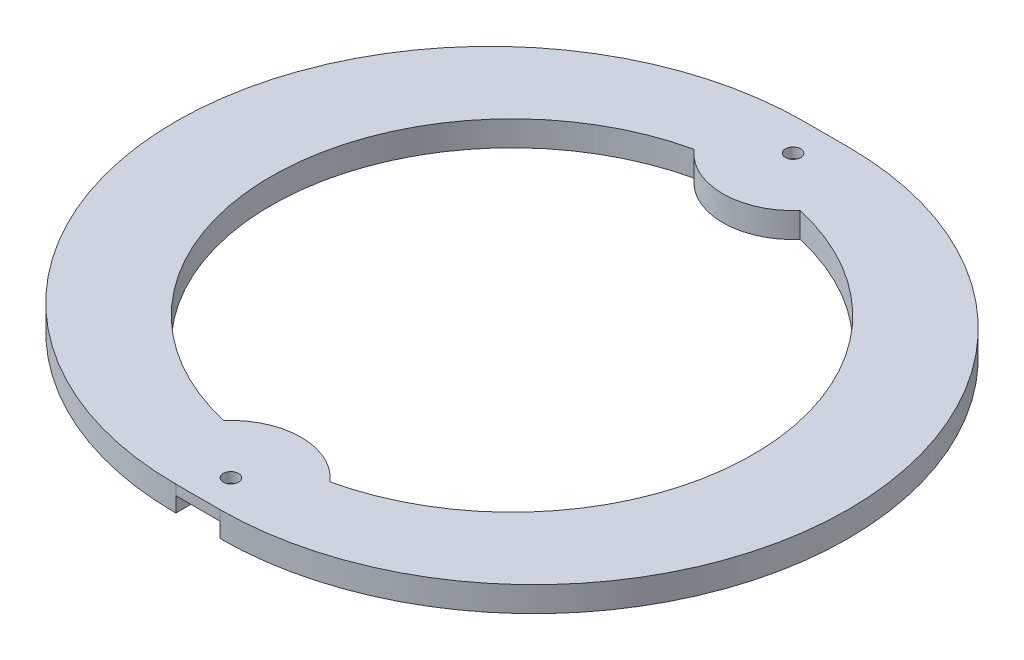
ISO-10303-21;
HEADER;
FILE_DESCRIPTION(('STEP AP214'),'2;1');
FILE_NAME('part.step','',(''),(''),'','','');
FILE_SCHEMA(('AUTOMOTIVE_DESIGN { 1 0 10303 214 1 1 1 1 }'));
ENDSEC;
DATA;
#1=APPLICATION_CONTEXT('core data for automotive mechanical design processes');
#2=APPLICATION_PROTOCOL_DEFINITION('international standard','automotive_design',2000,#1);
#3=PRODUCT_CONTEXT('',#1,'mechanical');
#4=PRODUCT('Part','Part','',(#3));
#5=PRODUCT_RELATED_PRODUCT_CATEGORY('part','',(#4));
#6=PRODUCT_DEFINITION_FORMATION('','',#4);
#7=PRODUCT_DEFINITION_CONTEXT('part definition',#1,'design');
#8=PRODUCT_DEFINITION('design','',#6,#7);
#9=PRODUCT_DEFINITION_SHAPE('','',#8);
#10=(LENGTH_UNIT() NAMED_UNIT(*) SI_UNIT(.MILLI.,.METRE.));
#11=(NAMED_UNIT(*) PLANE_ANGLE_UNIT() SI_UNIT($,.RADIAN.));
#12=(NAMED_UNIT(*) SI_UNIT($,.STERADIAN.) SOLID_ANGLE_UNIT());
#13=UNCERTAINTY_MEASURE_WITH_UNIT(LENGTH_MEASURE(1.E-05),#10,'distance_accuracy_value','');
#14=(GEOMETRIC_REPRESENTATION_CONTEXT(3) GLOBAL_UNCERTAINTY_ASSIGNED_CONTEXT((#13)) GLOBAL_UNIT_ASSIGNED_CONTEXT((#10,
#11,#12)) REPRESENTATION_CONTEXT('',''));
#15=CARTESIAN_POINT('',(0.,0.,0.));
#16=DIRECTION('',(0.,0.,1.));
#17=DIRECTION('',(1.,0.,0.));
#18=AXIS2_PLACEMENT_3D('',#15,#16,#17);
#19=CARTESIAN_POINT('',(-2.2,35.5393487414483,31.2840102232464));
#20=DIRECTION('',(0.,0.,-1.));
#21=DIRECTION('',(-1.,0.,0.));
#22=AXIS2_PLACEMENT_3D('',#19,#20,#21);
#23=PLANE('',#22);
#24=DIRECTION('',(-1.,0.,0.));
#25=VECTOR('',#24,1.);
#26=CARTESIAN_POINT('',(-2.2,34.5393487414483,31.2840102232464));
#27=LINE('',#26,#25);
#28=CARTESIAN_POINT('',(2.2,34.5393487414483,31.2840102232464));
#29=VERTEX_POINT('',#28);
#30=CARTESIAN_POINT('',(-2.2,34.5393487414483,31.2840102232464));
#31=VERTEX_POINT('',#30);
#32=EDGE_CURVE('E147',#29,#31,#27,.T.);
#33=ORIENTED_EDGE('',*,*,#32,.F.);
#34=DIRECTION('',(0.,-1.,0.));
#35=VECTOR('',#34,1.);
#36=CARTESIAN_POINT('',(2.2,35.5393487414483,31.2840102232464));
#37=LINE('',#36,#35);
#38=CARTESIAN_POINT('',(2.2,35.5393487414483,31.2840102232464));
#39=VERTEX_POINT('',#38);
#40=EDGE_CURVE('E246',#39,#29,#37,.T.);
#41=ORIENTED_EDGE('',*,*,#40,.F.);
#42=DIRECTION('',(1.,0.,0.));
#43=VECTOR('',#42,1.);
#44=CARTESIAN_POINT('',(-2.2,35.5393487414483,31.2840102232464));
#45=LINE('',#44,#43);
#46=CARTESIAN_POINT('',(-2.2,35.5393487414483,31.2840102232464));
#47=VERTEX_POINT('',#46);
#48=EDGE_CURVE('E244',#47,#39,#45,.T.);
#49=ORIENTED_EDGE('',*,*,#48,.F.);
#50=DIRECTION('',(0.,-1.,0.));
#51=VECTOR('',#50,1.);
#52=CARTESIAN_POINT('',(-2.2,35.5393487414483,31.2840102232464));
#53=LINE('',#52,#51);
#54=EDGE_CURVE('E253',#47,#31,#53,.T.);
#55=ORIENTED_EDGE('',*,*,#54,.T.);
#56=EDGE_LOOP('',(#33,#41,#49,#55));
#57=FACE_BOUND('',#56,.T.);
#58=ADVANCED_FACE('F32',(#57),#23,.F.);
#59=CARTESIAN_POINT('',(0.,35.5393487414483,28.));
#60=DIRECTION('',(0.,-1.,0.));
#61=DIRECTION('',(0.,0.,-1.));
#62=AXIS2_PLACEMENT_3D('',#59,#60,#61);
#63=CYLINDRICAL_SURFACE('',#62,0.759999999999998);
#64=CARTESIAN_POINT('',(0.,35.5393487414483,28.));
#65=DIRECTION('',(0.,1.,0.));
#66=DIRECTION('',(0.,0.,1.));
#67=AXIS2_PLACEMENT_3D('',#64,#65,#66);
#68=CIRCLE('',#67,0.759999999999998);
#69=CARTESIAN_POINT('',(0.,35.5393487414483,28.76));
#70=VERTEX_POINT('',#69);
#71=EDGE_CURVE('E229',#70,#70,#68,.T.);
#72=ORIENTED_EDGE('',*,*,#71,.T.);
#73=EDGE_LOOP('',(#72));
#74=FACE_BOUND('',#73,.T.);
#75=CARTESIAN_POINT('',(0.,34.5393487414483,28.));
#76=DIRECTION('',(0.,-1.,0.));
#77=DIRECTION('',(0.,0.,-1.));
#78=AXIS2_PLACEMENT_3D('',#75,#76,#77);
#79=CIRCLE('',#78,0.759999999999998);
#80=CARTESIAN_POINT('',(0.,34.5393487414483,27.24));
#81=VERTEX_POINT('',#80);
#82=EDGE_CURVE('E167',#81,#81,#79,.T.);
#83=ORIENTED_EDGE('',*,*,#82,.T.);
#84=EDGE_LOOP('',(#83));
#85=FACE_BOUND('',#84,.T.);
#86=ADVANCED_FACE('F278',(#74,#85),#63,.F.);
#87=CARTESIAN_POINT('',(2.2,35.5393487414483,0.));
#88=DIRECTION('',(0.,-1.,0.));
#89=DIRECTION('',(0.,0.,-1.));
#90=AXIS2_PLACEMENT_3D('',#87,#88,#89);
#91=PLANE('',#90);
#92=ORIENTED_EDGE('',*,*,#71,.F.);
#93=EDGE_LOOP('',(#92));
#94=FACE_BOUND('',#93,.T.);
#95=CARTESIAN_POINT('',(0.,35.5393487414483,-28.));
#96=DIRECTION('',(0.,1.,0.));
#97=DIRECTION('',(0.,0.,1.));
#98=AXIS2_PLACEMENT_3D('',#95,#96,#97);
#99=CIRCLE('',#98,0.759999999999998);
#100=CARTESIAN_POINT('',(0.,35.5393487414483,-27.24));
#101=VERTEX_POINT('',#100);
#102=EDGE_CURVE('E232',#101,#101,#99,.T.);
#103=ORIENTED_EDGE('',*,*,#102,.F.);
#104=EDGE_LOOP('',(#103));
#105=FACE_BOUND('',#104,.T.);
#106=CARTESIAN_POINT('',(2.2,35.5393487414483,0.));
#107=DIRECTION('',(0.,1.,0.));
#108=DIRECTION('',(0.,0.,-1.));
#109=AXIS2_PLACEMENT_3D('',#106,#107,#108);
#110=CIRCLE('',#109,31.2840102232464);
#111=CARTESIAN_POINT('',(2.2,35.5393487414483,-31.2840102232464));
#112=VERTEX_POINT('',#111);
#113=EDGE_CURVE('E236',#39,#112,#110,.T.);
#114=ORIENTED_EDGE('',*,*,#113,.T.);
#115=DIRECTION('',(-1.,0.,0.));
#116=VECTOR('',#115,1.);
#117=CARTESIAN_POINT('',(-2.2,35.5393487414483,-31.2840102232464));
#118=LINE('',#117,#116);
#119=CARTESIAN_POINT('',(-2.2,35.5393487414483,-31.2840102232464));
#120=VERTEX_POINT('',#119);
#121=EDGE_CURVE('E239',#112,#120,#118,.T.);
#122=ORIENTED_EDGE('',*,*,#121,.T.);
#123=CARTESIAN_POINT('',(-2.2,35.5393487414483,0.));
#124=DIRECTION('',(0.,1.,0.));
#125=DIRECTION('',(0.,0.,1.));
#126=AXIS2_PLACEMENT_3D('',#123,#124,#125);
#127=CIRCLE('',#126,31.2840102232464);
#128=EDGE_CURVE('E242',#120,#47,#127,.T.);
#129=ORIENTED_EDGE('',*,*,#128,.T.);
#130=ORIENTED_EDGE('',*,*,#48,.T.);
#131=EDGE_LOOP('',(#114,#122,#129,#130));
#132=FACE_BOUND('',#131,.T.);
#133=CARTESIAN_POINT('',(0.,35.5393487414483,0.));
#134=DIRECTION('',(0.,1.,0.));
#135=DIRECTION('',(0.,0.,1.));
#136=AXIS2_PLACEMENT_3D('',#133,#134,#135);
#137=CIRCLE('',#136,24.);
#138=CARTESIAN_POINT('',(-5.28568412153555,35.5393487414483,-23.4107142857143));
#139=VERTEX_POINT('',#138);
#140=CARTESIAN_POINT('',(-5.28568412153555,35.5393487414483,23.4107142857143));
#141=VERTEX_POINT('',#140);
#142=EDGE_CURVE('E200',#139,#141,#137,.T.);
#143=ORIENTED_EDGE('',*,*,#142,.F.);
#144=CARTESIAN_POINT('',(0.,35.5393487414483,-28.));
#145=DIRECTION('',(0.,-1.,0.));
#146=DIRECTION('',(0.,0.,1.));
#147=AXIS2_PLACEMENT_3D('',#144,#145,#146);
#148=CIRCLE('',#147,7.);
#149=CARTESIAN_POINT('',(5.28568412153555,35.5393487414483,-23.4107142857143));
#150=VERTEX_POINT('',#149);
#151=EDGE_CURVE('E207',#150,#139,#148,.T.);
#152=ORIENTED_EDGE('',*,*,#151,.F.);
#153=CARTESIAN_POINT('',(0.,35.5393487414483,0.));
#154=DIRECTION('',(0.,1.,0.));
#155=DIRECTION('',(0.,0.,-1.));
#156=AXIS2_PLACEMENT_3D('',#153,#154,#155);
#157=CIRCLE('',#156,24.);
#158=CARTESIAN_POINT('',(5.28568412153555,35.5393487414483,23.4107142857143));
#159=VERTEX_POINT('',#158);
#160=EDGE_CURVE('E205',#159,#150,#157,.T.);
#161=ORIENTED_EDGE('',*,*,#160,.F.);
#162=CARTESIAN_POINT('',(0.,35.5393487414483,28.));
#163=DIRECTION('',(0.,-1.,0.));
#164=DIRECTION('',(0.,0.,-1.));
#165=AXIS2_PLACEMENT_3D('',#162,#163,#164);
#166=CIRCLE('',#165,7.);
#167=EDGE_CURVE('E202',#141,#159,#166,.T.);
#168=ORIENTED_EDGE('',*,*,#167,.F.);
#169=EDGE_LOOP('',(#143,#152,#161,#168));
#170=FACE_BOUND('',#169,.T.);
#171=ADVANCED_FACE('F274',(#94,#105,#132,#170),#91,.F.);
#172=CARTESIAN_POINT('',(2.2,33.0393487414483,0.));
#173=DIRECTION('',(0.,-1.,0.));
#174=DIRECTION('',(0.,0.,-1.));
#175=AXIS2_PLACEMENT_3D('',#172,#173,#174);
#176=PLANE('',#175);
#177=DIRECTION('',(0.,0.,-1.));
#178=VECTOR('',#177,1.);
#179=CARTESIAN_POINT('',(-2.2,33.0393487414483,31.2840102232464));
#180=LINE('',#179,#178);
#181=CARTESIAN_POINT('',(-2.2,33.0393487414483,31.2840102232464));
#182=VERTEX_POINT('',#181);
#183=CARTESIAN_POINT('',(-2.2,33.0393487414483,23.7840102232464));
#184=VERTEX_POINT('',#183);
#185=EDGE_CURVE('E142',#182,#184,#180,.T.);
#186=ORIENTED_EDGE('',*,*,#185,.F.);
#187=CARTESIAN_POINT('',(-2.2,33.0393487414483,0.));
#188=DIRECTION('',(0.,1.,0.));
#189=DIRECTION('',(0.,0.,1.));
#190=AXIS2_PLACEMENT_3D('',#187,#188,#189);
#191=CIRCLE('',#190,31.2840102232464);
#192=CARTESIAN_POINT('',(-2.2,33.0393487414483,-31.2840102232464));
#193=VERTEX_POINT('',#192);
#194=EDGE_CURVE('E240',#193,#182,#191,.T.);
#195=ORIENTED_EDGE('',*,*,#194,.F.);
#196=DIRECTION('',(0.,0.,-1.));
#197=VECTOR('',#196,1.);
#198=CARTESIAN_POINT('',(-2.19999999999967,33.0393487414483,-31.2840102232464));
#199=LINE('',#198,#197);
#200=CARTESIAN_POINT('',(-2.19999999999999,33.0393487414483,-23.7840102232464));
#201=VERTEX_POINT('',#200);
#202=EDGE_CURVE('E186',#201,#193,#199,.T.);
#203=ORIENTED_EDGE('',*,*,#202,.F.);
#204=DIRECTION('',(-1.,0.,0.));
#205=VECTOR('',#204,1.);
#206=CARTESIAN_POINT('',(-2.19999999999999,33.0393487414483,-23.7840102232464));
#207=LINE('',#206,#205);
#208=CARTESIAN_POINT('',(2.2,33.0393487414483,-23.7840102232464));
#209=VERTEX_POINT('',#208);
#210=EDGE_CURVE('E176',#209,#201,#207,.T.);
#211=ORIENTED_EDGE('',*,*,#210,.F.);
#212=DIRECTION('',(0.,0.,1.));
#213=VECTOR('',#212,1.);
#214=CARTESIAN_POINT('',(2.2,33.0393487414483,-31.2840102232464));
#215=LINE('',#214,#213);
#216=CARTESIAN_POINT('',(2.2,33.0393487414483,-31.2840102232464));
#217=VERTEX_POINT('',#216);
#218=EDGE_CURVE('E188',#217,#209,#215,.T.);
#219=ORIENTED_EDGE('',*,*,#218,.F.);
#220=CARTESIAN_POINT('',(2.2,33.0393487414483,0.));
#221=DIRECTION('',(0.,1.,0.));
#222=DIRECTION('',(0.,0.,-1.));
#223=AXIS2_PLACEMENT_3D('',#220,#221,#222);
#224=CIRCLE('',#223,31.2840102232464);
#225=CARTESIAN_POINT('',(2.2,33.0393487414483,31.2840102232464));
#226=VERTEX_POINT('',#225);
#227=EDGE_CURVE('E235',#226,#217,#224,.T.);
#228=ORIENTED_EDGE('',*,*,#227,.F.);
#229=DIRECTION('',(0.,0.,1.));
#230=VECTOR('',#229,1.);
#231=CARTESIAN_POINT('',(2.2,33.0393487414483,31.2840102232464));
#232=LINE('',#231,#230);
#233=CARTESIAN_POINT('',(2.2,33.0393487414483,23.7840102232464));
#234=VERTEX_POINT('',#233);
#235=EDGE_CURVE('E155',#234,#226,#232,.T.);
#236=ORIENTED_EDGE('',*,*,#235,.F.);
#237=DIRECTION('',(1.,0.,0.));
#238=VECTOR('',#237,1.);
#239=CARTESIAN_POINT('',(-2.2,33.0393487414483,23.7840102232464));
#240=LINE('',#239,#238);
#241=EDGE_CURVE('E157',#184,#234,#240,.T.);
#242=ORIENTED_EDGE('',*,*,#241,.F.);
#243=EDGE_LOOP('',(#186,#195,#203,#211,#219,#228,#236,#242));
#244=FACE_BOUND('',#243,.T.);
#245=CARTESIAN_POINT('',(0.,33.0393487414483,-28.));
#246=DIRECTION('',(0.,-1.,0.));
#247=DIRECTION('',(0.,0.,1.));
#248=AXIS2_PLACEMENT_3D('',#245,#246,#247);
#249=CIRCLE('',#248,7.);
#250=CARTESIAN_POINT('',(5.28568412153555,33.0393487414483,-23.4107142857143));
#251=VERTEX_POINT('',#250);
#252=CARTESIAN_POINT('',(-5.28568412153555,33.0393487414483,-23.4107142857143));
#253=VERTEX_POINT('',#252);
#254=EDGE_CURVE('E203',#251,#253,#249,.T.);
#255=ORIENTED_EDGE('',*,*,#254,.T.);
#256=CARTESIAN_POINT('',(0.,33.0393487414483,0.));
#257=DIRECTION('',(0.,1.,0.));
#258=DIRECTION('',(0.,0.,1.));
#259=AXIS2_PLACEMENT_3D('',#256,#257,#258);
#260=CIRCLE('',#259,24.);
#261=CARTESIAN_POINT('',(-5.28568412153555,33.0393487414483,23.4107142857143));
#262=VERTEX_POINT('',#261);
#263=EDGE_CURVE('E210',#253,#262,#260,.T.);
#264=ORIENTED_EDGE('',*,*,#263,.T.);
#265=CARTESIAN_POINT('',(0.,33.0393487414483,28.));
#266=DIRECTION('',(0.,-1.,0.));
#267=DIRECTION('',(0.,0.,-1.));
#268=AXIS2_PLACEMENT_3D('',#265,#266,#267);
#269=CIRCLE('',#268,7.);
#270=CARTESIAN_POINT('',(5.28568412153555,33.0393487414483,23.4107142857143));
#271=VERTEX_POINT('',#270);
#272=EDGE_CURVE('E213',#262,#271,#269,.T.);
#273=ORIENTED_EDGE('',*,*,#272,.T.);
#274=CARTESIAN_POINT('',(0.,33.0393487414483,0.));
#275=DIRECTION('',(0.,1.,0.));
#276=DIRECTION('',(0.,0.,-1.));
#277=AXIS2_PLACEMENT_3D('',#274,#275,#276);
#278=CIRCLE('',#277,24.);
#279=EDGE_CURVE('E216',#271,#251,#278,.T.);
#280=ORIENTED_EDGE('',*,*,#279,.T.);
#281=EDGE_LOOP('',(#255,#264,#273,#280));
#282=FACE_BOUND('',#281,.T.);
#283=ADVANCED_FACE('F277',(#244,#282),#176,.T.);
#284=CARTESIAN_POINT('',(2.2,35.5393487414483,0.));
#285=DIRECTION('',(0.,-1.,0.));
#286=DIRECTION('',(0.,0.,-1.));
#287=AXIS2_PLACEMENT_3D('',#284,#285,#286);
#288=CYLINDRICAL_SURFACE('',#287,31.2840102232464);
#289=ORIENTED_EDGE('',*,*,#227,.T.);
#290=DIRECTION('',(0.,-1.,0.));
#291=VECTOR('',#290,1.);
#292=CARTESIAN_POINT('',(2.2,34.5393487414483,-31.2840102232464));
#293=LINE('',#292,#291);
#294=CARTESIAN_POINT('',(2.2,34.5393487414483,-31.2840102232464));
#295=VERTEX_POINT('',#294);
#296=EDGE_CURVE('E196',#295,#217,#293,.T.);
#297=ORIENTED_EDGE('',*,*,#296,.F.);
#298=DIRECTION('',(0.,-1.,0.));
#299=VECTOR('',#298,1.);
#300=CARTESIAN_POINT('',(2.2,35.5393487414483,-31.2840102232464));
#301=LINE('',#300,#299);
#302=EDGE_CURVE('E11',#112,#295,#301,.T.);
#303=ORIENTED_EDGE('',*,*,#302,.F.);
#304=ORIENTED_EDGE('',*,*,#113,.F.);
#305=ORIENTED_EDGE('',*,*,#40,.T.);
#306=DIRECTION('',(0.,-1.,0.));
#307=VECTOR('',#306,1.);
#308=CARTESIAN_POINT('',(2.2,34.5393487414483,31.2840102232464));
#309=LINE('',#308,#307);
#310=EDGE_CURVE('E168',#29,#226,#309,.T.);
#311=ORIENTED_EDGE('',*,*,#310,.T.);
#312=EDGE_LOOP('',(#289,#297,#303,#304,#305,#311));
#313=FACE_BOUND('',#312,.T.);
#314=ADVANCED_FACE('F34',(#313),#288,.T.);
#315=CARTESIAN_POINT('',(-2.2,35.5393487414483,-31.2840102232464));
#316=DIRECTION('',(0.,0.,1.));
#317=DIRECTION('',(1.,0.,0.));
#318=AXIS2_PLACEMENT_3D('',#315,#316,#317);
#319=PLANE('',#318);
#320=ORIENTED_EDGE('',*,*,#302,.T.);
#321=DIRECTION('',(1.,0.,0.));
#322=VECTOR('',#321,1.);
#323=CARTESIAN_POINT('',(-2.19999999999967,34.5393487414483,-31.2840102232464));
#324=LINE('',#323,#322);
#325=CARTESIAN_POINT('',(-2.19999999999967,34.5393487414483,-31.2840102232464));
#326=VERTEX_POINT('',#325);
#327=EDGE_CURVE('E175',#326,#295,#324,.T.);
#328=ORIENTED_EDGE('',*,*,#327,.F.);
#329=DIRECTION('',(0.,-1.,0.));
#330=VECTOR('',#329,1.);
#331=CARTESIAN_POINT('',(-2.2,35.5393487414483,-31.2840102232464));
#332=LINE('',#331,#330);
#333=EDGE_CURVE('E41',#120,#326,#332,.T.);
#334=ORIENTED_EDGE('',*,*,#333,.F.);
#335=ORIENTED_EDGE('',*,*,#121,.F.);
#336=EDGE_LOOP('',(#320,#328,#334,#335));
#337=FACE_BOUND('',#336,.T.);
#338=ADVANCED_FACE('F320',(#337),#319,.F.);
#339=CARTESIAN_POINT('',(-2.2,35.5393487414483,0.));
#340=DIRECTION('',(0.,-1.,0.));
#341=DIRECTION('',(0.,0.,-1.));
#342=AXIS2_PLACEMENT_3D('',#339,#340,#341);
#343=CYLINDRICAL_SURFACE('',#342,31.2840102232464);
#344=ORIENTED_EDGE('',*,*,#194,.T.);
#345=DIRECTION('',(0.,-1.,0.));
#346=VECTOR('',#345,1.);
#347=CARTESIAN_POINT('',(-2.2,34.5393487414483,31.2840102232464));
#348=LINE('',#347,#346);
#349=EDGE_CURVE('E165',#31,#182,#348,.T.);
#350=ORIENTED_EDGE('',*,*,#349,.F.);
#351=ORIENTED_EDGE('',*,*,#54,.F.);
#352=ORIENTED_EDGE('',*,*,#128,.F.);
#353=ORIENTED_EDGE('',*,*,#333,.T.);
#354=DIRECTION('',(0.,-1.,0.));
#355=VECTOR('',#354,1.);
#356=CARTESIAN_POINT('',(-2.19999999999967,34.5393487414483,-31.2840102232464));
#357=LINE('',#356,#355);
#358=EDGE_CURVE('E185',#326,#193,#357,.T.);
#359=ORIENTED_EDGE('',*,*,#358,.T.);
#360=EDGE_LOOP('',(#344,#350,#351,#352,#353,#359));
#361=FACE_BOUND('',#360,.T.);
#362=ADVANCED_FACE('F270',(#361),#343,.T.);
#363=CARTESIAN_POINT('',(0.,35.5393487414483,-28.));
#364=DIRECTION('',(0.,-1.,0.));
#365=DIRECTION('',(0.,0.,-1.));
#366=AXIS2_PLACEMENT_3D('',#363,#364,#365);
#367=CYLINDRICAL_SURFACE('',#366,0.759999999999998);
#368=CARTESIAN_POINT('',(0.,34.5393487414483,-28.));
#369=DIRECTION('',(0.,1.,0.));
#370=DIRECTION('',(0.,0.,1.));
#371=AXIS2_PLACEMENT_3D('',#368,#369,#370);
#372=CIRCLE('',#371,0.759999999999998);
#373=CARTESIAN_POINT('',(0.,34.5393487414483,-27.24));
#374=VERTEX_POINT('',#373);
#375=EDGE_CURVE('E36',#374,#374,#372,.T.);
#376=ORIENTED_EDGE('',*,*,#375,.F.);
#377=EDGE_LOOP('',(#376));
#378=FACE_BOUND('',#377,.T.);
#379=ORIENTED_EDGE('',*,*,#102,.T.);
#380=EDGE_LOOP('',(#379));
#381=FACE_BOUND('',#380,.T.);
#382=ADVANCED_FACE('F266',(#378,#381),#367,.F.);
#383=CARTESIAN_POINT('',(0.,35.5393487414483,0.));
#384=DIRECTION('',(0.,-1.,0.));
#385=DIRECTION('',(0.,0.,-1.));
#386=AXIS2_PLACEMENT_3D('',#383,#384,#385);
#387=CYLINDRICAL_SURFACE('',#386,24.);
#388=ORIENTED_EDGE('',*,*,#263,.F.);
#389=DIRECTION('',(0.,-1.,0.));
#390=VECTOR('',#389,1.);
#391=CARTESIAN_POINT('',(-5.28568412153555,35.5393487414483,-23.4107142857143));
#392=LINE('',#391,#390);
#393=EDGE_CURVE('E209',#139,#253,#392,.T.);
#394=ORIENTED_EDGE('',*,*,#393,.F.);
#395=ORIENTED_EDGE('',*,*,#142,.T.);
#396=DIRECTION('',(0.,-1.,0.));
#397=VECTOR('',#396,1.);
#398=CARTESIAN_POINT('',(-5.28568412153555,35.5393487414483,23.4107142857143));
#399=LINE('',#398,#397);
#400=EDGE_CURVE('E226',#141,#262,#399,.T.);
#401=ORIENTED_EDGE('',*,*,#400,.T.);
#402=EDGE_LOOP('',(#388,#394,#395,#401));
#403=FACE_BOUND('',#402,.T.);
#404=ADVANCED_FACE('F269',(#403),#387,.F.);
#405=CARTESIAN_POINT('',(0.,35.5393487414483,28.));
#406=DIRECTION('',(0.,-1.,0.));
#407=DIRECTION('',(0.,0.,-1.));
#408=AXIS2_PLACEMENT_3D('',#405,#406,#407);
#409=CYLINDRICAL_SURFACE('',#408,7.);
#410=ORIENTED_EDGE('',*,*,#272,.F.);
#411=ORIENTED_EDGE('',*,*,#400,.F.);
#412=ORIENTED_EDGE('',*,*,#167,.T.);
#413=DIRECTION('',(0.,-1.,0.));
#414=VECTOR('',#413,1.);
#415=CARTESIAN_POINT('',(5.28568412153555,35.5393487414483,23.4107142857143));
#416=LINE('',#415,#414);
#417=EDGE_CURVE('E224',#159,#271,#416,.T.);
#418=ORIENTED_EDGE('',*,*,#417,.T.);
#419=EDGE_LOOP('',(#410,#411,#412,#418));
#420=FACE_BOUND('',#419,.T.);
#421=ADVANCED_FACE('F292',(#420),#409,.T.);
#422=CARTESIAN_POINT('',(0.,35.5393487414483,0.));
#423=DIRECTION('',(0.,-1.,0.));
#424=DIRECTION('',(0.,0.,-1.));
#425=AXIS2_PLACEMENT_3D('',#422,#423,#424);
#426=CYLINDRICAL_SURFACE('',#425,24.);
#427=ORIENTED_EDGE('',*,*,#279,.F.);
#428=ORIENTED_EDGE('',*,*,#417,.F.);
#429=ORIENTED_EDGE('',*,*,#160,.T.);
#430=DIRECTION('',(0.,-1.,0.));
#431=VECTOR('',#430,1.);
#432=CARTESIAN_POINT('',(5.28568412153555,35.5393487414483,-23.4107142857143));
#433=LINE('',#432,#431);
#434=EDGE_CURVE('E57',#150,#251,#433,.T.);
#435=ORIENTED_EDGE('',*,*,#434,.T.);
#436=EDGE_LOOP('',(#427,#428,#429,#435));
#437=FACE_BOUND('',#436,.T.);
#438=ADVANCED_FACE('F298',(#437),#426,.F.);
#439=CARTESIAN_POINT('',(0.,35.5393487414483,-28.));
#440=DIRECTION('',(0.,-1.,0.));
#441=DIRECTION('',(0.,0.,-1.));
#442=AXIS2_PLACEMENT_3D('',#439,#440,#441);
#443=CYLINDRICAL_SURFACE('',#442,7.);
#444=ORIENTED_EDGE('',*,*,#254,.F.);
#445=ORIENTED_EDGE('',*,*,#434,.F.);
#446=ORIENTED_EDGE('',*,*,#151,.T.);
#447=ORIENTED_EDGE('',*,*,#393,.T.);
#448=EDGE_LOOP('',(#444,#445,#446,#447));
#449=FACE_BOUND('',#448,.T.);
#450=ADVANCED_FACE('F296',(#449),#443,.T.);
#451=CARTESIAN_POINT('',(-2.2,34.5393487414483,31.2840102232464));
#452=DIRECTION('',(-1.,0.,0.));
#453=DIRECTION('',(0.,0.,1.));
#454=AXIS2_PLACEMENT_3D('',#451,#452,#453);
#455=PLANE('',#454);
#456=ORIENTED_EDGE('',*,*,#185,.T.);
#457=DIRECTION('',(0.,-1.,0.));
#458=VECTOR('',#457,1.);
#459=CARTESIAN_POINT('',(-2.2,34.5393487414483,23.7840102232464));
#460=LINE('',#459,#458);
#461=CARTESIAN_POINT('',(-2.2,34.5393487414483,23.7840102232464));
#462=VERTEX_POINT('',#461);
#463=EDGE_CURVE('E136',#462,#184,#460,.T.);
#464=ORIENTED_EDGE('',*,*,#463,.F.);
#465=DIRECTION('',(0.,0.,-1.));
#466=VECTOR('',#465,1.);
#467=CARTESIAN_POINT('',(-2.2,34.5393487414483,31.2840102232464));
#468=LINE('',#467,#466);
#469=EDGE_CURVE('E140',#31,#462,#468,.T.);
#470=ORIENTED_EDGE('',*,*,#469,.F.);
#471=ORIENTED_EDGE('',*,*,#349,.T.);
#472=EDGE_LOOP('',(#456,#464,#470,#471));
#473=FACE_BOUND('',#472,.T.);
#474=ADVANCED_FACE('F138',(#473),#455,.F.);
#475=CARTESIAN_POINT('',(2.2,34.5393487414483,31.2840102232464));
#476=DIRECTION('',(1.,0.,0.));
#477=DIRECTION('',(0.,0.,-1.));
#478=AXIS2_PLACEMENT_3D('',#475,#476,#477);
#479=PLANE('',#478);
#480=ORIENTED_EDGE('',*,*,#235,.T.);
#481=ORIENTED_EDGE('',*,*,#310,.F.);
#482=DIRECTION('',(0.,0.,1.));
#483=VECTOR('',#482,1.);
#484=CARTESIAN_POINT('',(2.2,34.5393487414483,31.2840102232464));
#485=LINE('',#484,#483);
#486=CARTESIAN_POINT('',(2.2,34.5393487414483,23.7840102232464));
#487=VERTEX_POINT('',#486);
#488=EDGE_CURVE('E49',#487,#29,#485,.T.);
#489=ORIENTED_EDGE('',*,*,#488,.F.);
#490=DIRECTION('',(0.,-1.,0.));
#491=VECTOR('',#490,1.);
#492=CARTESIAN_POINT('',(2.2,34.5393487414483,23.7840102232464));
#493=LINE('',#492,#491);
#494=EDGE_CURVE('E146',#487,#234,#493,.T.);
#495=ORIENTED_EDGE('',*,*,#494,.T.);
#496=EDGE_LOOP('',(#480,#481,#489,#495));
#497=FACE_BOUND('',#496,.T.);
#498=ADVANCED_FACE('F304',(#497),#479,.F.);
#499=CARTESIAN_POINT('',(-2.2,34.5393487414483,23.7840102232464));
#500=DIRECTION('',(0.,0.,-1.));
#501=DIRECTION('',(-1.,0.,0.));
#502=AXIS2_PLACEMENT_3D('',#499,#500,#501);
#503=PLANE('',#502);
#504=ORIENTED_EDGE('',*,*,#241,.T.);
#505=ORIENTED_EDGE('',*,*,#494,.F.);
#506=DIRECTION('',(1.,0.,0.));
#507=VECTOR('',#506,1.);
#508=CARTESIAN_POINT('',(-2.2,34.5393487414483,23.7840102232464));
#509=LINE('',#508,#507);
#510=EDGE_CURVE('E149',#462,#487,#509,.T.);
#511=ORIENTED_EDGE('',*,*,#510,.F.);
#512=ORIENTED_EDGE('',*,*,#463,.T.);
#513=EDGE_LOOP('',(#504,#505,#511,#512));
#514=FACE_BOUND('',#513,.T.);
#515=ADVANCED_FACE('F150',(#514),#503,.F.);
#516=CARTESIAN_POINT('',(0.,34.5393487414483,0.));
#517=DIRECTION('',(0.,-1.,0.));
#518=DIRECTION('',(0.,0.,-1.));
#519=AXIS2_PLACEMENT_3D('',#516,#517,#518);
#520=PLANE('',#519);
#521=ORIENTED_EDGE('',*,*,#82,.F.);
#522=EDGE_LOOP('',(#521));
#523=FACE_BOUND('',#522,.T.);
#524=ORIENTED_EDGE('',*,*,#469,.T.);
#525=ORIENTED_EDGE('',*,*,#510,.T.);
#526=ORIENTED_EDGE('',*,*,#488,.T.);
#527=ORIENTED_EDGE('',*,*,#32,.T.);
#528=EDGE_LOOP('',(#524,#525,#526,#527));
#529=FACE_BOUND('',#528,.T.);
#530=ADVANCED_FACE('F152',(#523,#529),#520,.T.);
#531=CARTESIAN_POINT('',(-2.19999999999967,34.5393487414483,-31.2840102232464));
#532=DIRECTION('',(-1.,0.,0.));
#533=DIRECTION('',(0.,0.,1.));
#534=AXIS2_PLACEMENT_3D('',#531,#532,#533);
#535=PLANE('',#534);
#536=ORIENTED_EDGE('',*,*,#202,.T.);
#537=ORIENTED_EDGE('',*,*,#358,.F.);
#538=DIRECTION('',(0.,0.,-1.));
#539=VECTOR('',#538,1.);
#540=CARTESIAN_POINT('',(-2.19999999999967,34.5393487414483,-31.2840102232464));
#541=LINE('',#540,#539);
#542=CARTESIAN_POINT('',(-2.19999999999999,34.5393487414483,-23.7840102232464));
#543=VERTEX_POINT('',#542);
#544=EDGE_CURVE('E172',#543,#326,#541,.T.);
#545=ORIENTED_EDGE('',*,*,#544,.F.);
#546=DIRECTION('',(0.,-1.,0.));
#547=VECTOR('',#546,1.);
#548=CARTESIAN_POINT('',(-2.19999999999999,34.5393487414483,-23.7840102232464));
#549=LINE('',#548,#547);
#550=EDGE_CURVE('E163',#543,#201,#549,.T.);
#551=ORIENTED_EDGE('',*,*,#550,.T.);
#552=EDGE_LOOP('',(#536,#537,#545,#551));
#553=FACE_BOUND('',#552,.T.);
#554=ADVANCED_FACE('F345',(#553),#535,.F.);
#555=CARTESIAN_POINT('',(-2.19999999999999,34.5393487414483,-23.7840102232464));
#556=DIRECTION('',(0.,0.,1.));
#557=DIRECTION('',(1.,0.,0.));
#558=AXIS2_PLACEMENT_3D('',#555,#556,#557);
#559=PLANE('',#558);
#560=ORIENTED_EDGE('',*,*,#210,.T.);
#561=ORIENTED_EDGE('',*,*,#550,.F.);
#562=DIRECTION('',(-1.,0.,0.));
#563=VECTOR('',#562,1.);
#564=CARTESIAN_POINT('',(-2.19999999999999,34.5393487414483,-23.7840102232464));
#565=LINE('',#564,#563);
#566=CARTESIAN_POINT('',(2.2,34.5393487414483,-23.7840102232464));
#567=VERTEX_POINT('',#566);
#568=EDGE_CURVE('E182',#567,#543,#565,.T.);
#569=ORIENTED_EDGE('',*,*,#568,.F.);
#570=DIRECTION('',(0.,-1.,0.));
#571=VECTOR('',#570,1.);
#572=CARTESIAN_POINT('',(2.2,34.5393487414483,-23.7840102232464));
#573=LINE('',#572,#571);
#574=EDGE_CURVE('E194',#567,#209,#573,.T.);
#575=ORIENTED_EDGE('',*,*,#574,.T.);
#576=EDGE_LOOP('',(#560,#561,#569,#575));
#577=FACE_BOUND('',#576,.T.);
#578=ADVANCED_FACE('F341',(#577),#559,.F.);
#579=CARTESIAN_POINT('',(2.2,34.5393487414483,-31.2840102232464));
#580=DIRECTION('',(1.,0.,0.));
#581=DIRECTION('',(0.,0.,-1.));
#582=AXIS2_PLACEMENT_3D('',#579,#580,#581);
#583=PLANE('',#582);
#584=ORIENTED_EDGE('',*,*,#218,.T.);
#585=ORIENTED_EDGE('',*,*,#574,.F.);
#586=DIRECTION('',(0.,0.,1.));
#587=VECTOR('',#586,1.);
#588=CARTESIAN_POINT('',(2.2,34.5393487414483,-31.2840102232464));
#589=LINE('',#588,#587);
#590=EDGE_CURVE('E179',#295,#567,#589,.T.);
#591=ORIENTED_EDGE('',*,*,#590,.F.);
#592=ORIENTED_EDGE('',*,*,#296,.T.);
#593=EDGE_LOOP('',(#584,#585,#591,#592));
#594=FACE_BOUND('',#593,.T.);
#595=ADVANCED_FACE('F334',(#594),#583,.F.);
#596=CARTESIAN_POINT('',(0.,34.5393487414483,0.));
#597=DIRECTION('',(0.,1.,0.));
#598=DIRECTION('',(0.,0.,1.));
#599=AXIS2_PLACEMENT_3D('',#596,#597,#598);
#600=PLANE('',#599);
#601=ORIENTED_EDGE('',*,*,#375,.T.);
#602=EDGE_LOOP('',(#601));
#603=FACE_BOUND('',#602,.T.);
#604=ORIENTED_EDGE('',*,*,#544,.T.);
#605=ORIENTED_EDGE('',*,*,#327,.T.);
#606=ORIENTED_EDGE('',*,*,#590,.T.);
#607=ORIENTED_EDGE('',*,*,#568,.T.);
#608=EDGE_LOOP('',(#604,#605,#606,#607));
#609=FACE_BOUND('',#608,.T.);
#610=ADVANCED_FACE('F263',(#603,#609),#600,.F.);
#611=CLOSED_SHELL('',(#58,#86,#171,#283,#314,#338,#362,#382,#404,#421,#438,#450,#474,#498,#515,
#530,#554,#578,#595,#610));
#612=MANIFOLD_SOLID_BREP('B2',#611);
#613=ADVANCED_BREP_SHAPE_REPRESENTATION('',(#18,#612),#14);
#614=SHAPE_DEFINITION_REPRESENTATION(#9,#613);
ENDSEC;
END-ISO-10303-21;
